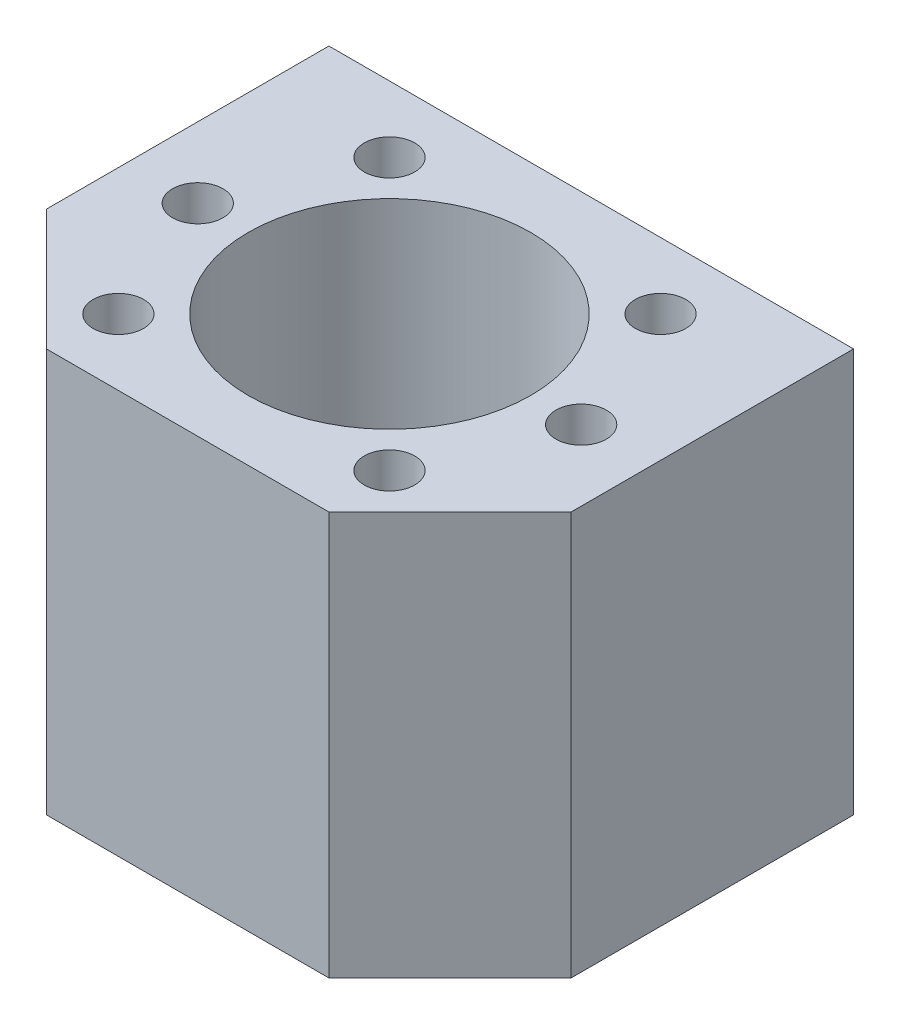
ISO-10303-21;
HEADER;
FILE_DESCRIPTION(('STEP AP214'),'2;1');
FILE_NAME('part.step','',(''),(''),'','','');
FILE_SCHEMA(('AUTOMOTIVE_DESIGN { 1 0 10303 214 1 1 1 1 }'));
ENDSEC;
DATA;
#1=APPLICATION_CONTEXT('core data for automotive mechanical design processes');
#2=APPLICATION_PROTOCOL_DEFINITION('international standard','automotive_design',2000,#1);
#3=PRODUCT_CONTEXT('',#1,'mechanical');
#4=PRODUCT('Part','Part','',(#3));
#5=PRODUCT_RELATED_PRODUCT_CATEGORY('part','',(#4));
#6=PRODUCT_DEFINITION_FORMATION('','',#4);
#7=PRODUCT_DEFINITION_CONTEXT('part definition',#1,'design');
#8=PRODUCT_DEFINITION('design','',#6,#7);
#9=PRODUCT_DEFINITION_SHAPE('','',#8);
#10=(LENGTH_UNIT() NAMED_UNIT(*) SI_UNIT(.MILLI.,.METRE.));
#11=(NAMED_UNIT(*) PLANE_ANGLE_UNIT() SI_UNIT($,.RADIAN.));
#12=(NAMED_UNIT(*) SI_UNIT($,.STERADIAN.) SOLID_ANGLE_UNIT());
#13=UNCERTAINTY_MEASURE_WITH_UNIT(LENGTH_MEASURE(1.E-05),#10,'distance_accuracy_value','');
#14=(GEOMETRIC_REPRESENTATION_CONTEXT(3) GLOBAL_UNCERTAINTY_ASSIGNED_CONTEXT((#13)) GLOBAL_UNIT_ASSIGNED_CONTEXT((#10,
#11,#12)) REPRESENTATION_CONTEXT('',''));
#15=CARTESIAN_POINT('',(0.,0.,0.));
#16=DIRECTION('',(0.,0.,1.));
#17=DIRECTION('',(1.,0.,0.));
#18=AXIS2_PLACEMENT_3D('',#15,#16,#17);
#19=CARTESIAN_POINT('',(0.,40.,0.));
#20=DIRECTION('',(0.,1.,0.));
#21=DIRECTION('',(0.,0.,1.));
#22=AXIS2_PLACEMENT_3D('',#19,#20,#21);
#23=PLANE('',#22);
#24=CARTESIAN_POINT('',(-19.,40.,0.));
#25=DIRECTION('',(0.,1.,0.));
#26=DIRECTION('',(0.,0.,1.));
#27=AXIS2_PLACEMENT_3D('',#24,#25,#26);
#28=CIRCLE('',#27,2.50000000000013);
#29=CARTESIAN_POINT('',(-19.,40.,2.50000000000006));
#30=VERTEX_POINT('',#29);
#31=EDGE_CURVE('E260',#30,#30,#28,.T.);
#32=ORIENTED_EDGE('',*,*,#31,.F.);
#33=EDGE_LOOP('',(#32));
#34=FACE_BOUND('',#33,.T.);
#35=CARTESIAN_POINT('',(13.4350288425443,40.,13.4350288425443));
#36=DIRECTION('',(0.,1.,0.));
#37=DIRECTION('',(0.,0.,1.));
#38=AXIS2_PLACEMENT_3D('',#35,#36,#37);
#39=CIRCLE('',#38,2.50000000000013);
#40=CARTESIAN_POINT('',(13.4350288425443,40.,15.9350288425444));
#41=VERTEX_POINT('',#40);
#42=EDGE_CURVE('E272',#41,#41,#39,.T.);
#43=ORIENTED_EDGE('',*,*,#42,.F.);
#44=EDGE_LOOP('',(#43));
#45=FACE_BOUND('',#44,.T.);
#46=CARTESIAN_POINT('',(13.4350288425444,40.,-13.4350288425444));
#47=DIRECTION('',(0.,1.,0.));
#48=DIRECTION('',(0.,0.,1.));
#49=AXIS2_PLACEMENT_3D('',#46,#47,#48);
#50=CIRCLE('',#49,2.50000000000008);
#51=CARTESIAN_POINT('',(13.4350288425444,40.,-10.9350288425443));
#52=VERTEX_POINT('',#51);
#53=EDGE_CURVE('E284',#52,#52,#50,.T.);
#54=ORIENTED_EDGE('',*,*,#53,.F.);
#55=EDGE_LOOP('',(#54));
#56=FACE_BOUND('',#55,.T.);
#57=DIRECTION('',(0.,0.,1.));
#58=VECTOR('',#57,1.);
#59=CARTESIAN_POINT('',(-26.,40.,-20.));
#60=LINE('',#59,#58);
#61=CARTESIAN_POINT('',(-26.,40.,-20.));
#62=VERTEX_POINT('',#61);
#63=CARTESIAN_POINT('',(-26.,40.,8.));
#64=VERTEX_POINT('',#63);
#65=EDGE_CURVE('E131',#62,#64,#60,.T.);
#66=ORIENTED_EDGE('',*,*,#65,.T.);
#67=DIRECTION('',(0.707106781186548,0.,0.707106781186548));
#68=VECTOR('',#67,1.);
#69=CARTESIAN_POINT('',(-26.,40.,8.));
#70=LINE('',#69,#68);
#71=CARTESIAN_POINT('',(-14.,40.,20.));
#72=VERTEX_POINT('',#71);
#73=EDGE_CURVE('E89',#64,#72,#70,.T.);
#74=ORIENTED_EDGE('',*,*,#73,.T.);
#75=DIRECTION('',(1.,0.,0.));
#76=VECTOR('',#75,1.);
#77=CARTESIAN_POINT('',(-14.,40.,20.));
#78=LINE('',#77,#76);
#79=CARTESIAN_POINT('',(14.,40.,20.));
#80=VERTEX_POINT('',#79);
#81=EDGE_CURVE('E102',#72,#80,#78,.T.);
#82=ORIENTED_EDGE('',*,*,#81,.T.);
#83=DIRECTION('',(0.707106781186548,0.,-0.707106781186548));
#84=VECTOR('',#83,1.);
#85=CARTESIAN_POINT('',(14.,40.,20.));
#86=LINE('',#85,#84);
#87=CARTESIAN_POINT('',(26.,40.,8.));
#88=VERTEX_POINT('',#87);
#89=EDGE_CURVE('E96',#80,#88,#86,.T.);
#90=ORIENTED_EDGE('',*,*,#89,.T.);
#91=DIRECTION('',(0.,0.,-1.));
#92=VECTOR('',#91,1.);
#93=CARTESIAN_POINT('',(26.,40.,-20.));
#94=LINE('',#93,#92);
#95=CARTESIAN_POINT('',(26.,40.,-20.));
#96=VERTEX_POINT('',#95);
#97=EDGE_CURVE('E100',#88,#96,#94,.T.);
#98=ORIENTED_EDGE('',*,*,#97,.T.);
#99=DIRECTION('',(-1.,0.,0.));
#100=VECTOR('',#99,1.);
#101=CARTESIAN_POINT('',(-26.,40.,-20.));
#102=LINE('',#101,#100);
#103=EDGE_CURVE('E52',#96,#62,#102,.T.);
#104=ORIENTED_EDGE('',*,*,#103,.T.);
#105=EDGE_LOOP('',(#66,#74,#82,#90,#98,#104));
#106=FACE_BOUND('',#105,.T.);
#107=CARTESIAN_POINT('',(0.,40.,0.));
#108=DIRECTION('',(0.,1.,0.));
#109=DIRECTION('',(0.,0.,1.));
#110=AXIS2_PLACEMENT_3D('',#107,#108,#109);
#111=CIRCLE('',#110,14.);
#112=CARTESIAN_POINT('',(0.,40.,14.));
#113=VERTEX_POINT('',#112);
#114=EDGE_CURVE('E124',#113,#113,#111,.T.);
#115=ORIENTED_EDGE('',*,*,#114,.F.);
#116=EDGE_LOOP('',(#115));
#117=FACE_BOUND('',#116,.T.);
#118=CARTESIAN_POINT('',(18.9999999999999,40.,0.));
#119=DIRECTION('',(0.,1.,0.));
#120=DIRECTION('',(0.,0.,1.));
#121=AXIS2_PLACEMENT_3D('',#118,#119,#120);
#122=CIRCLE('',#121,2.50000000000012);
#123=CARTESIAN_POINT('',(18.9999999999999,40.,2.50000000000008));
#124=VERTEX_POINT('',#123);
#125=EDGE_CURVE('E278',#124,#124,#122,.T.);
#126=ORIENTED_EDGE('',*,*,#125,.F.);
#127=EDGE_LOOP('',(#126));
#128=FACE_BOUND('',#127,.T.);
#129=CARTESIAN_POINT('',(-13.4350288425444,40.,13.4350288425443));
#130=DIRECTION('',(0.,1.,0.));
#131=DIRECTION('',(0.,0.,1.));
#132=AXIS2_PLACEMENT_3D('',#129,#130,#131);
#133=CIRCLE('',#132,2.5000000000001);
#134=CARTESIAN_POINT('',(-13.4350288425444,40.,15.9350288425444));
#135=VERTEX_POINT('',#134);
#136=EDGE_CURVE('E266',#135,#135,#133,.T.);
#137=ORIENTED_EDGE('',*,*,#136,.F.);
#138=EDGE_LOOP('',(#137));
#139=FACE_BOUND('',#138,.T.);
#140=CARTESIAN_POINT('',(-13.4350288425444,40.,-13.4350288425444));
#141=DIRECTION('',(0.,1.,0.));
#142=DIRECTION('',(0.,0.,1.));
#143=AXIS2_PLACEMENT_3D('',#140,#141,#142);
#144=CIRCLE('',#143,2.50000000000018);
#145=CARTESIAN_POINT('',(-13.4350288425444,40.,-10.9350288425442));
#146=VERTEX_POINT('',#145);
#147=EDGE_CURVE('E254',#146,#146,#144,.T.);
#148=ORIENTED_EDGE('',*,*,#147,.F.);
#149=EDGE_LOOP('',(#148));
#150=FACE_BOUND('',#149,.T.);
#151=ADVANCED_FACE('F35',(#34,#45,#56,#106,#117,#128,#139,#150),#23,.T.);
#152=CARTESIAN_POINT('',(0.,0.,0.));
#153=DIRECTION('',(0.,1.,0.));
#154=DIRECTION('',(0.,0.,1.));
#155=AXIS2_PLACEMENT_3D('',#152,#153,#154);
#156=PLANE('',#155);
#157=CARTESIAN_POINT('',(-19.,0.,0.));
#158=DIRECTION('',(0.,1.,0.));
#159=DIRECTION('',(0.,0.,1.));
#160=AXIS2_PLACEMENT_3D('',#157,#158,#159);
#161=CIRCLE('',#160,2.50000000000013);
#162=CARTESIAN_POINT('',(-19.,0.,2.50000000000006));
#163=VERTEX_POINT('',#162);
#164=EDGE_CURVE('E257',#163,#163,#161,.T.);
#165=ORIENTED_EDGE('',*,*,#164,.T.);
#166=EDGE_LOOP('',(#165));
#167=FACE_BOUND('',#166,.T.);
#168=CARTESIAN_POINT('',(13.4350288425443,0.,13.4350288425443));
#169=DIRECTION('',(0.,1.,0.));
#170=DIRECTION('',(0.,0.,1.));
#171=AXIS2_PLACEMENT_3D('',#168,#169,#170);
#172=CIRCLE('',#171,2.50000000000013);
#173=CARTESIAN_POINT('',(13.4350288425443,0.,15.9350288425444));
#174=VERTEX_POINT('',#173);
#175=EDGE_CURVE('E269',#174,#174,#172,.T.);
#176=ORIENTED_EDGE('',*,*,#175,.T.);
#177=EDGE_LOOP('',(#176));
#178=FACE_BOUND('',#177,.T.);
#179=CARTESIAN_POINT('',(13.4350288425444,0.,-13.4350288425444));
#180=DIRECTION('',(0.,1.,0.));
#181=DIRECTION('',(0.,0.,1.));
#182=AXIS2_PLACEMENT_3D('',#179,#180,#181);
#183=CIRCLE('',#182,2.50000000000008);
#184=CARTESIAN_POINT('',(13.4350288425444,0.,-10.9350288425443));
#185=VERTEX_POINT('',#184);
#186=EDGE_CURVE('E281',#185,#185,#183,.T.);
#187=ORIENTED_EDGE('',*,*,#186,.T.);
#188=EDGE_LOOP('',(#187));
#189=FACE_BOUND('',#188,.T.);
#190=DIRECTION('',(0.,0.,1.));
#191=VECTOR('',#190,1.);
#192=CARTESIAN_POINT('',(-26.,0.,-20.));
#193=LINE('',#192,#191);
#194=CARTESIAN_POINT('',(-26.,0.,-20.));
#195=VERTEX_POINT('',#194);
#196=CARTESIAN_POINT('',(-26.,0.,8.));
#197=VERTEX_POINT('',#196);
#198=EDGE_CURVE('E120',#195,#197,#193,.T.);
#199=ORIENTED_EDGE('',*,*,#198,.F.);
#200=DIRECTION('',(-1.,0.,0.));
#201=VECTOR('',#200,1.);
#202=CARTESIAN_POINT('',(-26.,0.,-20.));
#203=LINE('',#202,#201);
#204=CARTESIAN_POINT('',(26.,0.,-20.));
#205=VERTEX_POINT('',#204);
#206=EDGE_CURVE('E81',#205,#195,#203,.T.);
#207=ORIENTED_EDGE('',*,*,#206,.F.);
#208=DIRECTION('',(0.,0.,-1.));
#209=VECTOR('',#208,1.);
#210=CARTESIAN_POINT('',(26.,0.,-20.));
#211=LINE('',#210,#209);
#212=CARTESIAN_POINT('',(26.,0.,8.));
#213=VERTEX_POINT('',#212);
#214=EDGE_CURVE('E75',#213,#205,#211,.T.);
#215=ORIENTED_EDGE('',*,*,#214,.F.);
#216=DIRECTION('',(0.707106781186548,0.,-0.707106781186548));
#217=VECTOR('',#216,1.);
#218=CARTESIAN_POINT('',(14.,0.,20.));
#219=LINE('',#218,#217);
#220=CARTESIAN_POINT('',(14.,0.,20.));
#221=VERTEX_POINT('',#220);
#222=EDGE_CURVE('E110',#221,#213,#219,.T.);
#223=ORIENTED_EDGE('',*,*,#222,.F.);
#224=DIRECTION('',(1.,0.,0.));
#225=VECTOR('',#224,1.);
#226=CARTESIAN_POINT('',(-14.,0.,20.));
#227=LINE('',#226,#225);
#228=CARTESIAN_POINT('',(-14.,0.,20.));
#229=VERTEX_POINT('',#228);
#230=EDGE_CURVE('E126',#229,#221,#227,.T.);
#231=ORIENTED_EDGE('',*,*,#230,.F.);
#232=DIRECTION('',(0.707106781186548,0.,0.707106781186548));
#233=VECTOR('',#232,1.);
#234=CARTESIAN_POINT('',(-26.,0.,8.));
#235=LINE('',#234,#233);
#236=EDGE_CURVE('E123',#197,#229,#235,.T.);
#237=ORIENTED_EDGE('',*,*,#236,.F.);
#238=EDGE_LOOP('',(#199,#207,#215,#223,#231,#237));
#239=FACE_BOUND('',#238,.T.);
#240=CARTESIAN_POINT('',(0.,0.,0.));
#241=DIRECTION('',(0.,1.,0.));
#242=DIRECTION('',(0.,0.,1.));
#243=AXIS2_PLACEMENT_3D('',#240,#241,#242);
#244=CIRCLE('',#243,14.);
#245=CARTESIAN_POINT('',(0.,0.,14.));
#246=VERTEX_POINT('',#245);
#247=EDGE_CURVE('E287',#246,#246,#244,.T.);
#248=ORIENTED_EDGE('',*,*,#247,.T.);
#249=EDGE_LOOP('',(#248));
#250=FACE_BOUND('',#249,.T.);
#251=CARTESIAN_POINT('',(18.9999999999999,0.,0.));
#252=DIRECTION('',(0.,1.,0.));
#253=DIRECTION('',(0.,0.,1.));
#254=AXIS2_PLACEMENT_3D('',#251,#252,#253);
#255=CIRCLE('',#254,2.50000000000012);
#256=CARTESIAN_POINT('',(18.9999999999999,0.,2.50000000000008));
#257=VERTEX_POINT('',#256);
#258=EDGE_CURVE('E275',#257,#257,#255,.T.);
#259=ORIENTED_EDGE('',*,*,#258,.T.);
#260=EDGE_LOOP('',(#259));
#261=FACE_BOUND('',#260,.T.);
#262=CARTESIAN_POINT('',(-13.4350288425444,0.,13.4350288425443));
#263=DIRECTION('',(0.,1.,0.));
#264=DIRECTION('',(0.,0.,1.));
#265=AXIS2_PLACEMENT_3D('',#262,#263,#264);
#266=CIRCLE('',#265,2.5000000000001);
#267=CARTESIAN_POINT('',(-13.4350288425444,0.,15.9350288425444));
#268=VERTEX_POINT('',#267);
#269=EDGE_CURVE('E263',#268,#268,#266,.T.);
#270=ORIENTED_EDGE('',*,*,#269,.T.);
#271=EDGE_LOOP('',(#270));
#272=FACE_BOUND('',#271,.T.);
#273=CARTESIAN_POINT('',(-13.4350288425444,0.,-13.4350288425444));
#274=DIRECTION('',(0.,1.,0.));
#275=DIRECTION('',(0.,0.,1.));
#276=AXIS2_PLACEMENT_3D('',#273,#274,#275);
#277=CIRCLE('',#276,2.50000000000018);
#278=CARTESIAN_POINT('',(-13.4350288425444,0.,-10.9350288425442));
#279=VERTEX_POINT('',#278);
#280=EDGE_CURVE('E251',#279,#279,#277,.T.);
#281=ORIENTED_EDGE('',*,*,#280,.T.);
#282=EDGE_LOOP('',(#281));
#283=FACE_BOUND('',#282,.T.);
#284=ADVANCED_FACE('F140',(#167,#178,#189,#239,#250,#261,#272,#283),#156,.F.);
#285=CARTESIAN_POINT('',(-26.,40.,-20.));
#286=DIRECTION('',(1.,0.,0.));
#287=DIRECTION('',(0.,0.,-1.));
#288=AXIS2_PLACEMENT_3D('',#285,#286,#287);
#289=PLANE('',#288);
#290=ORIENTED_EDGE('',*,*,#198,.T.);
#291=DIRECTION('',(0.,-1.,0.));
#292=VECTOR('',#291,1.);
#293=CARTESIAN_POINT('',(-26.,40.,8.));
#294=LINE('',#293,#292);
#295=EDGE_CURVE('E11',#64,#197,#294,.T.);
#296=ORIENTED_EDGE('',*,*,#295,.F.);
#297=ORIENTED_EDGE('',*,*,#65,.F.);
#298=DIRECTION('',(0.,-1.,0.));
#299=VECTOR('',#298,1.);
#300=CARTESIAN_POINT('',(-26.,40.,-20.));
#301=LINE('',#300,#299);
#302=EDGE_CURVE('E116',#62,#195,#301,.T.);
#303=ORIENTED_EDGE('',*,*,#302,.T.);
#304=EDGE_LOOP('',(#290,#296,#297,#303));
#305=FACE_BOUND('',#304,.T.);
#306=ADVANCED_FACE('F37',(#305),#289,.F.);
#307=CARTESIAN_POINT('',(-26.,40.,8.));
#308=DIRECTION('',(0.707106781186548,0.,-0.707106781186548));
#309=DIRECTION('',(-0.707106781186548,0.,-0.707106781186548));
#310=AXIS2_PLACEMENT_3D('',#307,#308,#309);
#311=PLANE('',#310);
#312=ORIENTED_EDGE('',*,*,#236,.T.);
#313=DIRECTION('',(0.,-1.,0.));
#314=VECTOR('',#313,1.);
#315=CARTESIAN_POINT('',(-14.,40.,20.));
#316=LINE('',#315,#314);
#317=EDGE_CURVE('E44',#72,#229,#316,.T.);
#318=ORIENTED_EDGE('',*,*,#317,.F.);
#319=ORIENTED_EDGE('',*,*,#73,.F.);
#320=ORIENTED_EDGE('',*,*,#295,.T.);
#321=EDGE_LOOP('',(#312,#318,#319,#320));
#322=FACE_BOUND('',#321,.T.);
#323=ADVANCED_FACE('F416',(#322),#311,.F.);
#324=CARTESIAN_POINT('',(-14.,40.,20.));
#325=DIRECTION('',(0.,0.,-1.));
#326=DIRECTION('',(-1.,0.,0.));
#327=AXIS2_PLACEMENT_3D('',#324,#325,#326);
#328=PLANE('',#327);
#329=ORIENTED_EDGE('',*,*,#230,.T.);
#330=DIRECTION('',(0.,-1.,0.));
#331=VECTOR('',#330,1.);
#332=CARTESIAN_POINT('',(14.,40.,20.));
#333=LINE('',#332,#331);
#334=EDGE_CURVE('E111',#80,#221,#333,.T.);
#335=ORIENTED_EDGE('',*,*,#334,.F.);
#336=ORIENTED_EDGE('',*,*,#81,.F.);
#337=ORIENTED_EDGE('',*,*,#317,.T.);
#338=EDGE_LOOP('',(#329,#335,#336,#337));
#339=FACE_BOUND('',#338,.T.);
#340=ADVANCED_FACE('F137',(#339),#328,.F.);
#341=CARTESIAN_POINT('',(14.,40.,20.));
#342=DIRECTION('',(-0.707106781186548,0.,-0.707106781186548));
#343=DIRECTION('',(-0.707106781186548,0.,0.707106781186548));
#344=AXIS2_PLACEMENT_3D('',#341,#342,#343);
#345=PLANE('',#344);
#346=ORIENTED_EDGE('',*,*,#222,.T.);
#347=DIRECTION('',(0.,-1.,0.));
#348=VECTOR('',#347,1.);
#349=CARTESIAN_POINT('',(26.,40.,8.));
#350=LINE('',#349,#348);
#351=EDGE_CURVE('E107',#88,#213,#350,.T.);
#352=ORIENTED_EDGE('',*,*,#351,.F.);
#353=ORIENTED_EDGE('',*,*,#89,.F.);
#354=ORIENTED_EDGE('',*,*,#334,.T.);
#355=EDGE_LOOP('',(#346,#352,#353,#354));
#356=FACE_BOUND('',#355,.T.);
#357=ADVANCED_FACE('F108',(#356),#345,.F.);
#358=CARTESIAN_POINT('',(26.,40.,-20.));
#359=DIRECTION('',(-1.,0.,0.));
#360=DIRECTION('',(0.,0.,1.));
#361=AXIS2_PLACEMENT_3D('',#358,#359,#360);
#362=PLANE('',#361);
#363=ORIENTED_EDGE('',*,*,#214,.T.);
#364=DIRECTION('',(0.,-1.,0.));
#365=VECTOR('',#364,1.);
#366=CARTESIAN_POINT('',(26.,40.,-20.));
#367=LINE('',#366,#365);
#368=EDGE_CURVE('E112',#96,#205,#367,.T.);
#369=ORIENTED_EDGE('',*,*,#368,.F.);
#370=ORIENTED_EDGE('',*,*,#97,.F.);
#371=ORIENTED_EDGE('',*,*,#351,.T.);
#372=EDGE_LOOP('',(#363,#369,#370,#371));
#373=FACE_BOUND('',#372,.T.);
#374=ADVANCED_FACE('F114',(#373),#362,.F.);
#375=CARTESIAN_POINT('',(-26.,40.,-20.));
#376=DIRECTION('',(0.,0.,1.));
#377=DIRECTION('',(1.,0.,0.));
#378=AXIS2_PLACEMENT_3D('',#375,#376,#377);
#379=PLANE('',#378);
#380=CARTESIAN_POINT('',(-20.,8.,-20.));
#381=DIRECTION('',(0.,0.,-1.));
#382=DIRECTION('',(-1.,0.,0.));
#383=AXIS2_PLACEMENT_3D('',#380,#381,#382);
#384=CIRCLE('',#383,2.5);
#385=CARTESIAN_POINT('',(-22.5,8.,-20.));
#386=VERTEX_POINT('',#385);
#387=EDGE_CURVE('E231',#386,#386,#384,.T.);
#388=ORIENTED_EDGE('',*,*,#387,.F.);
#389=EDGE_LOOP('',(#388));
#390=FACE_BOUND('',#389,.T.);
#391=CARTESIAN_POINT('',(-20.,32.,-20.));
#392=DIRECTION('',(0.,0.,-1.));
#393=DIRECTION('',(-1.,0.,0.));
#394=AXIS2_PLACEMENT_3D('',#391,#392,#393);
#395=CIRCLE('',#394,2.5);
#396=CARTESIAN_POINT('',(-22.5,32.,-20.));
#397=VERTEX_POINT('',#396);
#398=EDGE_CURVE('E230',#397,#397,#395,.T.);
#399=ORIENTED_EDGE('',*,*,#398,.F.);
#400=EDGE_LOOP('',(#399));
#401=FACE_BOUND('',#400,.T.);
#402=CARTESIAN_POINT('',(20.,8.,-20.));
#403=DIRECTION('',(0.,0.,-1.));
#404=DIRECTION('',(-1.,0.,0.));
#405=AXIS2_PLACEMENT_3D('',#402,#403,#404);
#406=CIRCLE('',#405,2.5);
#407=CARTESIAN_POINT('',(17.5,8.,-20.));
#408=VERTEX_POINT('',#407);
#409=EDGE_CURVE('E240',#408,#408,#406,.T.);
#410=ORIENTED_EDGE('',*,*,#409,.F.);
#411=EDGE_LOOP('',(#410));
#412=FACE_BOUND('',#411,.T.);
#413=CARTESIAN_POINT('',(20.,32.,-20.));
#414=DIRECTION('',(0.,0.,-1.));
#415=DIRECTION('',(-1.,0.,0.));
#416=AXIS2_PLACEMENT_3D('',#413,#414,#415);
#417=CIRCLE('',#416,2.5);
#418=CARTESIAN_POINT('',(17.5,32.,-20.));
#419=VERTEX_POINT('',#418);
#420=EDGE_CURVE('E245',#419,#419,#417,.T.);
#421=ORIENTED_EDGE('',*,*,#420,.F.);
#422=EDGE_LOOP('',(#421));
#423=FACE_BOUND('',#422,.T.);
#424=ORIENTED_EDGE('',*,*,#206,.T.);
#425=ORIENTED_EDGE('',*,*,#302,.F.);
#426=ORIENTED_EDGE('',*,*,#103,.F.);
#427=ORIENTED_EDGE('',*,*,#368,.T.);
#428=EDGE_LOOP('',(#424,#425,#426,#427));
#429=FACE_BOUND('',#428,.T.);
#430=ADVANCED_FACE('F145',(#390,#401,#412,#423,#429),#379,.F.);
#431=CARTESIAN_POINT('',(0.,40.,0.));
#432=DIRECTION('',(0.,-1.,0.));
#433=DIRECTION('',(0.,0.,-1.));
#434=AXIS2_PLACEMENT_3D('',#431,#432,#433);
#435=CYLINDRICAL_SURFACE('',#434,14.);
#436=ORIENTED_EDGE('',*,*,#114,.T.);
#437=EDGE_LOOP('',(#436));
#438=FACE_BOUND('',#437,.T.);
#439=ORIENTED_EDGE('',*,*,#247,.F.);
#440=EDGE_LOOP('',(#439));
#441=FACE_BOUND('',#440,.T.);
#442=ADVANCED_FACE('F147',(#438,#441),#435,.F.);
#443=CARTESIAN_POINT('',(13.4350288425444,40.,-13.4350288425444));
#444=DIRECTION('',(0.,-1.,0.));
#445=DIRECTION('',(0.,0.,-1.));
#446=AXIS2_PLACEMENT_3D('',#443,#444,#445);
#447=CYLINDRICAL_SURFACE('',#446,2.50000000000008);
#448=ORIENTED_EDGE('',*,*,#53,.T.);
#449=EDGE_LOOP('',(#448));
#450=FACE_BOUND('',#449,.T.);
#451=ORIENTED_EDGE('',*,*,#186,.F.);
#452=EDGE_LOOP('',(#451));
#453=FACE_BOUND('',#452,.T.);
#454=ADVANCED_FACE('F154',(#450,#453),#447,.F.);
#455=CARTESIAN_POINT('',(18.9999999999999,40.,0.));
#456=DIRECTION('',(0.,-1.,0.));
#457=DIRECTION('',(0.,0.,-1.));
#458=AXIS2_PLACEMENT_3D('',#455,#456,#457);
#459=CYLINDRICAL_SURFACE('',#458,2.50000000000012);
#460=ORIENTED_EDGE('',*,*,#125,.T.);
#461=EDGE_LOOP('',(#460));
#462=FACE_BOUND('',#461,.T.);
#463=ORIENTED_EDGE('',*,*,#258,.F.);
#464=EDGE_LOOP('',(#463));
#465=FACE_BOUND('',#464,.T.);
#466=ADVANCED_FACE('F173',(#462,#465),#459,.F.);
#467=CARTESIAN_POINT('',(13.4350288425443,40.,13.4350288425443));
#468=DIRECTION('',(0.,-1.,0.));
#469=DIRECTION('',(0.,0.,-1.));
#470=AXIS2_PLACEMENT_3D('',#467,#468,#469);
#471=CYLINDRICAL_SURFACE('',#470,2.50000000000013);
#472=ORIENTED_EDGE('',*,*,#42,.T.);
#473=EDGE_LOOP('',(#472));
#474=FACE_BOUND('',#473,.T.);
#475=ORIENTED_EDGE('',*,*,#175,.F.);
#476=EDGE_LOOP('',(#475));
#477=FACE_BOUND('',#476,.T.);
#478=ADVANCED_FACE('F177',(#474,#477),#471,.F.);
#479=CARTESIAN_POINT('',(-13.4350288425444,40.,13.4350288425443));
#480=DIRECTION('',(0.,-1.,0.));
#481=DIRECTION('',(0.,0.,-1.));
#482=AXIS2_PLACEMENT_3D('',#479,#480,#481);
#483=CYLINDRICAL_SURFACE('',#482,2.5000000000001);
#484=ORIENTED_EDGE('',*,*,#136,.T.);
#485=EDGE_LOOP('',(#484));
#486=FACE_BOUND('',#485,.T.);
#487=ORIENTED_EDGE('',*,*,#269,.F.);
#488=EDGE_LOOP('',(#487));
#489=FACE_BOUND('',#488,.T.);
#490=ADVANCED_FACE('F181',(#486,#489),#483,.F.);
#491=CARTESIAN_POINT('',(-19.,40.,0.));
#492=DIRECTION('',(0.,-1.,0.));
#493=DIRECTION('',(0.,0.,-1.));
#494=AXIS2_PLACEMENT_3D('',#491,#492,#493);
#495=CYLINDRICAL_SURFACE('',#494,2.50000000000013);
#496=ORIENTED_EDGE('',*,*,#31,.T.);
#497=EDGE_LOOP('',(#496));
#498=FACE_BOUND('',#497,.T.);
#499=ORIENTED_EDGE('',*,*,#164,.F.);
#500=EDGE_LOOP('',(#499));
#501=FACE_BOUND('',#500,.T.);
#502=ADVANCED_FACE('F185',(#498,#501),#495,.F.);
#503=CARTESIAN_POINT('',(-13.4350288425444,40.,-13.4350288425444));
#504=DIRECTION('',(0.,-1.,0.));
#505=DIRECTION('',(0.,0.,-1.));
#506=AXIS2_PLACEMENT_3D('',#503,#504,#505);
#507=CYLINDRICAL_SURFACE('',#506,2.50000000000018);
#508=ORIENTED_EDGE('',*,*,#147,.T.);
#509=EDGE_LOOP('',(#508));
#510=FACE_BOUND('',#509,.T.);
#511=ORIENTED_EDGE('',*,*,#280,.F.);
#512=EDGE_LOOP('',(#511));
#513=FACE_BOUND('',#512,.T.);
#514=ADVANCED_FACE('F189',(#510,#513),#507,.F.);
#515=CARTESIAN_POINT('',(20.,32.,-10.));
#516=DIRECTION('',(0.,0.,-1.));
#517=DIRECTION('',(-1.,0.,0.));
#518=AXIS2_PLACEMENT_3D('',#515,#516,#517);
#519=CYLINDRICAL_SURFACE('',#518,2.5);
#520=CARTESIAN_POINT('',(20.,32.,-10.));
#521=DIRECTION('',(0.,0.,-1.));
#522=DIRECTION('',(-1.,0.,0.));
#523=AXIS2_PLACEMENT_3D('',#520,#521,#522);
#524=CIRCLE('',#523,2.5);
#525=CARTESIAN_POINT('',(17.5,32.,-10.));
#526=VERTEX_POINT('',#525);
#527=EDGE_CURVE('E248',#526,#526,#524,.T.);
#528=ORIENTED_EDGE('',*,*,#527,.F.);
#529=EDGE_LOOP('',(#528));
#530=FACE_BOUND('',#529,.T.);
#531=ORIENTED_EDGE('',*,*,#420,.T.);
#532=EDGE_LOOP('',(#531));
#533=FACE_BOUND('',#532,.T.);
#534=ADVANCED_FACE('F193',(#530,#533),#519,.F.);
#535=CARTESIAN_POINT('',(20.,32.,-10.));
#536=DIRECTION('',(0.,0.,-1.));
#537=DIRECTION('',(-1.,0.,0.));
#538=AXIS2_PLACEMENT_3D('',#535,#536,#537);
#539=PLANE('',#538);
#540=ORIENTED_EDGE('',*,*,#527,.T.);
#541=EDGE_LOOP('',(#540));
#542=FACE_BOUND('',#541,.T.);
#543=ADVANCED_FACE('F197',(#542),#539,.T.);
#544=CARTESIAN_POINT('',(20.,8.,-10.));
#545=DIRECTION('',(0.,0.,-1.));
#546=DIRECTION('',(-1.,0.,0.));
#547=AXIS2_PLACEMENT_3D('',#544,#545,#546);
#548=CYLINDRICAL_SURFACE('',#547,2.5);
#549=CARTESIAN_POINT('',(20.,8.,-10.));
#550=DIRECTION('',(0.,0.,-1.));
#551=DIRECTION('',(-1.,0.,0.));
#552=AXIS2_PLACEMENT_3D('',#549,#550,#551);
#553=CIRCLE('',#552,2.5);
#554=CARTESIAN_POINT('',(17.5,8.,-10.));
#555=VERTEX_POINT('',#554);
#556=EDGE_CURVE('E242',#555,#555,#553,.T.);
#557=ORIENTED_EDGE('',*,*,#556,.F.);
#558=EDGE_LOOP('',(#557));
#559=FACE_BOUND('',#558,.T.);
#560=ORIENTED_EDGE('',*,*,#409,.T.);
#561=EDGE_LOOP('',(#560));
#562=FACE_BOUND('',#561,.T.);
#563=ADVANCED_FACE('F201',(#559,#562),#548,.F.);
#564=CARTESIAN_POINT('',(20.,8.,-10.));
#565=DIRECTION('',(0.,0.,-1.));
#566=DIRECTION('',(-1.,0.,0.));
#567=AXIS2_PLACEMENT_3D('',#564,#565,#566);
#568=PLANE('',#567);
#569=ORIENTED_EDGE('',*,*,#556,.T.);
#570=EDGE_LOOP('',(#569));
#571=FACE_BOUND('',#570,.T.);
#572=ADVANCED_FACE('F205',(#571),#568,.T.);
#573=CARTESIAN_POINT('',(-20.,32.,-10.));
#574=DIRECTION('',(0.,0.,-1.));
#575=DIRECTION('',(-1.,0.,0.));
#576=AXIS2_PLACEMENT_3D('',#573,#574,#575);
#577=CYLINDRICAL_SURFACE('',#576,2.5);
#578=CARTESIAN_POINT('',(-20.,32.,-10.));
#579=DIRECTION('',(0.,0.,-1.));
#580=DIRECTION('',(-1.,0.,0.));
#581=AXIS2_PLACEMENT_3D('',#578,#579,#580);
#582=CIRCLE('',#581,2.5);
#583=CARTESIAN_POINT('',(-22.5,32.,-10.));
#584=VERTEX_POINT('',#583);
#585=EDGE_CURVE('E234',#584,#584,#582,.T.);
#586=ORIENTED_EDGE('',*,*,#585,.F.);
#587=EDGE_LOOP('',(#586));
#588=FACE_BOUND('',#587,.T.);
#589=ORIENTED_EDGE('',*,*,#398,.T.);
#590=EDGE_LOOP('',(#589));
#591=FACE_BOUND('',#590,.T.);
#592=ADVANCED_FACE('F209',(#588,#591),#577,.F.);
#593=CARTESIAN_POINT('',(-20.,32.,-10.));
#594=DIRECTION('',(0.,0.,-1.));
#595=DIRECTION('',(-1.,0.,0.));
#596=AXIS2_PLACEMENT_3D('',#593,#594,#595);
#597=PLANE('',#596);
#598=ORIENTED_EDGE('',*,*,#585,.T.);
#599=EDGE_LOOP('',(#598));
#600=FACE_BOUND('',#599,.T.);
#601=ADVANCED_FACE('F213',(#600),#597,.T.);
#602=CARTESIAN_POINT('',(-20.,8.,-10.));
#603=DIRECTION('',(0.,0.,-1.));
#604=DIRECTION('',(-1.,0.,0.));
#605=AXIS2_PLACEMENT_3D('',#602,#603,#604);
#606=CYLINDRICAL_SURFACE('',#605,2.5);
#607=CARTESIAN_POINT('',(-20.,8.,-10.));
#608=DIRECTION('',(0.,0.,-1.));
#609=DIRECTION('',(-1.,0.,0.));
#610=AXIS2_PLACEMENT_3D('',#607,#608,#609);
#611=CIRCLE('',#610,2.5);
#612=CARTESIAN_POINT('',(-22.5,8.,-10.));
#613=VERTEX_POINT('',#612);
#614=EDGE_CURVE('E229',#613,#613,#611,.T.);
#615=ORIENTED_EDGE('',*,*,#614,.F.);
#616=EDGE_LOOP('',(#615));
#617=FACE_BOUND('',#616,.T.);
#618=ORIENTED_EDGE('',*,*,#387,.T.);
#619=EDGE_LOOP('',(#618));
#620=FACE_BOUND('',#619,.T.);
#621=ADVANCED_FACE('F217',(#617,#620),#606,.F.);
#622=CARTESIAN_POINT('',(-20.,8.,-10.));
#623=DIRECTION('',(0.,0.,-1.));
#624=DIRECTION('',(-1.,0.,0.));
#625=AXIS2_PLACEMENT_3D('',#622,#623,#624);
#626=PLANE('',#625);
#627=ORIENTED_EDGE('',*,*,#614,.T.);
#628=EDGE_LOOP('',(#627));
#629=FACE_BOUND('',#628,.T.);
#630=ADVANCED_FACE('F221',(#629),#626,.T.);
#631=CLOSED_SHELL('',(#151,#284,#306,#323,#340,#357,#374,#430,#442,#454,#466,#478,#490,#502,
#514,#534,#543,#563,#572,#592,#601,#621,#630));
#632=MANIFOLD_SOLID_BREP('B2',#631);
#633=ADVANCED_BREP_SHAPE_REPRESENTATION('',(#18,#632),#14);
#634=SHAPE_DEFINITION_REPRESENTATION(#9,#633);
ENDSEC;
END-ISO-10303-21;
